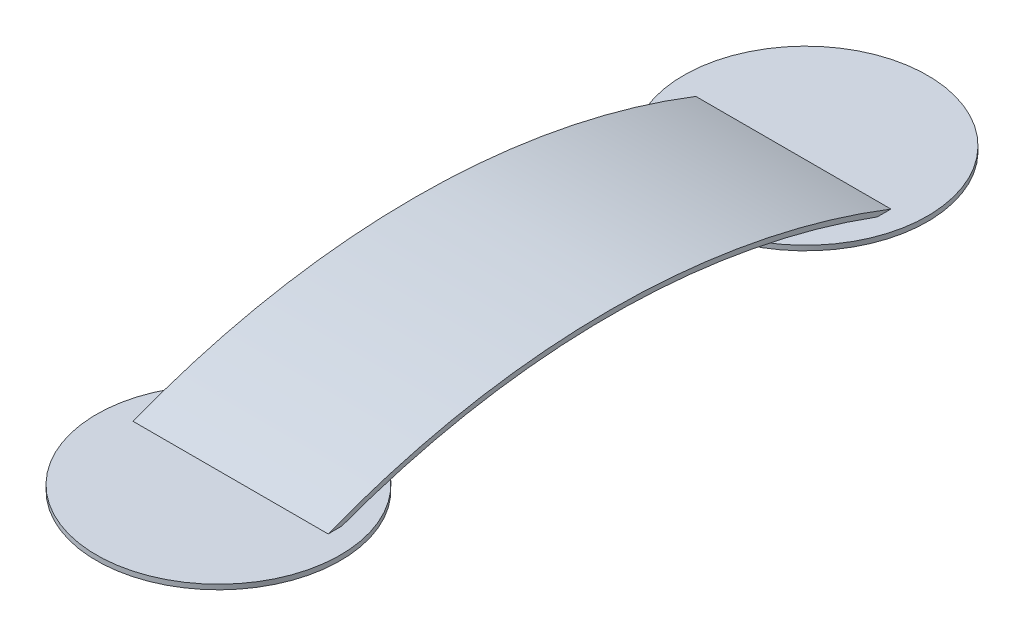
ISO-10303-21;
HEADER;
FILE_DESCRIPTION(('STEP AP214'),'2;1');
FILE_NAME('part.step','',(''),(''),'','','');
FILE_SCHEMA(('AUTOMOTIVE_DESIGN { 1 0 10303 214 1 1 1 1 }'));
ENDSEC;
DATA;
#1=APPLICATION_CONTEXT('core data for automotive mechanical design processes');
#2=APPLICATION_PROTOCOL_DEFINITION('international standard','automotive_design',2000,#1);
#3=PRODUCT_CONTEXT('',#1,'mechanical');
#4=PRODUCT('Part','Part','',(#3));
#5=PRODUCT_RELATED_PRODUCT_CATEGORY('part','',(#4));
#6=PRODUCT_DEFINITION_FORMATION('','',#4);
#7=PRODUCT_DEFINITION_CONTEXT('part definition',#1,'design');
#8=PRODUCT_DEFINITION('design','',#6,#7);
#9=PRODUCT_DEFINITION_SHAPE('','',#8);
#10=(LENGTH_UNIT() NAMED_UNIT(*) SI_UNIT(.MILLI.,.METRE.));
#11=(NAMED_UNIT(*) PLANE_ANGLE_UNIT() SI_UNIT($,.RADIAN.));
#12=(NAMED_UNIT(*) SI_UNIT($,.STERADIAN.) SOLID_ANGLE_UNIT());
#13=UNCERTAINTY_MEASURE_WITH_UNIT(LENGTH_MEASURE(1.E-05),#10,'distance_accuracy_value','');
#14=(GEOMETRIC_REPRESENTATION_CONTEXT(3) GLOBAL_UNCERTAINTY_ASSIGNED_CONTEXT((#13)) GLOBAL_UNIT_ASSIGNED_CONTEXT((#10,
#11,#12)) REPRESENTATION_CONTEXT('',''));
#15=CARTESIAN_POINT('',(0.,0.,0.));
#16=DIRECTION('',(0.,0.,1.));
#17=DIRECTION('',(1.,0.,0.));
#18=AXIS2_PLACEMENT_3D('',#15,#16,#17);
#19=CARTESIAN_POINT('',(8.,-29.3269903327954,0.));
#20=DIRECTION('',(-1.,0.,0.));
#21=DIRECTION('',(0.,0.,1.));
#22=AXIS2_PLACEMENT_3D('',#19,#20,#21);
#23=CYLINDRICAL_SURFACE('',#22,31.7011485819148);
#24=DIRECTION('',(-1.,0.,0.));
#25=VECTOR('',#24,1.);
#26=CARTESIAN_POINT('',(8.,0.199999999999999,11.537749490245));
#27=LINE('',#26,#25);
#28=CARTESIAN_POINT('',(8.,0.199999999999999,11.537749490245));
#29=VERTEX_POINT('',#28);
#30=CARTESIAN_POINT('',(0.,0.199999999999999,11.537749490245));
#31=VERTEX_POINT('',#30);
#32=EDGE_CURVE('E54',#29,#31,#27,.T.);
#33=ORIENTED_EDGE('',*,*,#32,.F.);
#34=CARTESIAN_POINT('',(8.,-29.3269903327954,0.));
#35=DIRECTION('',(1.,0.,0.));
#36=DIRECTION('',(0.,0.,1.));
#37=AXIS2_PLACEMENT_3D('',#34,#35,#36);
#38=CIRCLE('',#37,31.7011485819148);
#39=CARTESIAN_POINT('',(8.,0.199999999999999,-11.537749490245));
#40=VERTEX_POINT('',#39);
#41=EDGE_CURVE('E94',#40,#29,#38,.T.);
#42=ORIENTED_EDGE('',*,*,#41,.F.);
#43=DIRECTION('',(-1.,0.,0.));
#44=VECTOR('',#43,1.);
#45=CARTESIAN_POINT('',(8.,0.199999999999999,-11.537749490245));
#46=LINE('',#45,#44);
#47=CARTESIAN_POINT('',(0.,0.199999999999999,-11.537749490245));
#48=VERTEX_POINT('',#47);
#49=EDGE_CURVE('E111',#40,#48,#46,.T.);
#50=ORIENTED_EDGE('',*,*,#49,.T.);
#51=CARTESIAN_POINT('',(0.,-29.3269903327954,0.));
#52=DIRECTION('',(1.,0.,0.));
#53=DIRECTION('',(0.,0.,1.));
#54=AXIS2_PLACEMENT_3D('',#51,#52,#53);
#55=CIRCLE('',#54,31.7011485819148);
#56=EDGE_CURVE('E95',#48,#31,#55,.T.);
#57=ORIENTED_EDGE('',*,*,#56,.T.);
#58=EDGE_LOOP('',(#33,#42,#50,#57));
#59=FACE_BOUND('',#58,.T.);
#60=ADVANCED_FACE('F39',(#59),#23,.T.);
#61=CARTESIAN_POINT('',(8.,-29.3269903327954,0.));
#62=DIRECTION('',(-1.,0.,0.));
#63=DIRECTION('',(0.,0.,1.));
#64=AXIS2_PLACEMENT_3D('',#61,#62,#63);
#65=CYLINDRICAL_SURFACE('',#64,31.5011485819148);
#66=DIRECTION('',(-1.,0.,0.));
#67=VECTOR('',#66,1.);
#68=CARTESIAN_POINT('',(8.,0.199999999999999,10.9763019212703));
#69=LINE('',#68,#67);
#70=CARTESIAN_POINT('',(0.,0.199999999999999,10.9763019212703));
#71=VERTEX_POINT('',#70);
#72=CARTESIAN_POINT('',(8.,0.199999999999999,10.9763019212703));
#73=VERTEX_POINT('',#72);
#74=EDGE_CURVE('E79',#71,#73,#69,.F.);
#75=ORIENTED_EDGE('',*,*,#74,.F.);
#76=CARTESIAN_POINT('',(0.,-29.3269903327954,0.));
#77=DIRECTION('',(-1.,0.,0.));
#78=DIRECTION('',(0.,0.,1.));
#79=AXIS2_PLACEMENT_3D('',#76,#77,#78);
#80=CIRCLE('',#79,31.5011485819148);
#81=CARTESIAN_POINT('',(0.,0.199999999999999,-10.9763019212703));
#82=VERTEX_POINT('',#81);
#83=EDGE_CURVE('E85',#71,#82,#80,.T.);
#84=ORIENTED_EDGE('',*,*,#83,.T.);
#85=DIRECTION('',(-1.,0.,0.));
#86=VECTOR('',#85,1.);
#87=CARTESIAN_POINT('',(8.,0.199999999999999,-10.9763019212703));
#88=LINE('',#87,#86);
#89=CARTESIAN_POINT('',(8.,0.199999999999999,-10.9763019212703));
#90=VERTEX_POINT('',#89);
#91=EDGE_CURVE('E115',#82,#90,#88,.F.);
#92=ORIENTED_EDGE('',*,*,#91,.T.);
#93=CARTESIAN_POINT('',(8.,-29.3269903327954,0.));
#94=DIRECTION('',(-1.,0.,0.));
#95=DIRECTION('',(0.,0.,1.));
#96=AXIS2_PLACEMENT_3D('',#93,#94,#95);
#97=CIRCLE('',#96,31.5011485819148);
#98=EDGE_CURVE('E61',#73,#90,#97,.T.);
#99=ORIENTED_EDGE('',*,*,#98,.F.);
#100=EDGE_LOOP('',(#75,#84,#92,#99));
#101=FACE_BOUND('',#100,.T.);
#102=ADVANCED_FACE('F84',(#101),#65,.F.);
#103=CARTESIAN_POINT('',(8.,-29.3269903327954,0.));
#104=DIRECTION('',(-1.,0.,0.));
#105=DIRECTION('',(0.,0.,1.));
#106=AXIS2_PLACEMENT_3D('',#103,#104,#105);
#107=PLANE('',#106);
#108=DIRECTION('',(0.,0.,1.));
#109=VECTOR('',#108,1.);
#110=CARTESIAN_POINT('',(8.,0.199999999999999,0.));
#111=LINE('',#110,#109);
#112=EDGE_CURVE('E123',#73,#29,#111,.T.);
#113=ORIENTED_EDGE('',*,*,#112,.F.);
#114=ORIENTED_EDGE('',*,*,#98,.T.);
#115=DIRECTION('',(0.,0.,-1.));
#116=VECTOR('',#115,1.);
#117=CARTESIAN_POINT('',(8.,0.199999999999999,0.));
#118=LINE('',#117,#116);
#119=EDGE_CURVE('E101',#90,#40,#118,.T.);
#120=ORIENTED_EDGE('',*,*,#119,.T.);
#121=ORIENTED_EDGE('',*,*,#41,.T.);
#122=EDGE_LOOP('',(#113,#114,#120,#121));
#123=FACE_BOUND('',#122,.T.);
#124=ADVANCED_FACE('F156',(#123),#107,.F.);
#125=CARTESIAN_POINT('',(0.,-29.3269903327954,0.));
#126=DIRECTION('',(-1.,0.,0.));
#127=DIRECTION('',(0.,0.,1.));
#128=AXIS2_PLACEMENT_3D('',#125,#126,#127);
#129=PLANE('',#128);
#130=ORIENTED_EDGE('',*,*,#83,.F.);
#131=DIRECTION('',(0.,0.,1.));
#132=VECTOR('',#131,1.);
#133=CARTESIAN_POINT('',(0.,0.199999999999999,0.));
#134=LINE('',#133,#132);
#135=EDGE_CURVE('E11',#71,#31,#134,.T.);
#136=ORIENTED_EDGE('',*,*,#135,.T.);
#137=ORIENTED_EDGE('',*,*,#56,.F.);
#138=DIRECTION('',(0.,0.,-1.));
#139=VECTOR('',#138,1.);
#140=CARTESIAN_POINT('',(0.,0.199999999999999,0.));
#141=LINE('',#140,#139);
#142=EDGE_CURVE('E47',#82,#48,#141,.T.);
#143=ORIENTED_EDGE('',*,*,#142,.F.);
#144=EDGE_LOOP('',(#130,#136,#137,#143));
#145=FACE_BOUND('',#144,.T.);
#146=ADVANCED_FACE('F90',(#145),#129,.T.);
#147=CARTESIAN_POINT('',(4.,0.2,-12.0370452949537));
#148=DIRECTION('',(0.,1.,0.));
#149=DIRECTION('',(0.,0.,1.));
#150=AXIS2_PLACEMENT_3D('',#147,#148,#149);
#151=PLANE('',#150);
#152=CARTESIAN_POINT('',(4.,0.2,-12.0370452949537));
#153=DIRECTION('',(0.,1.,0.));
#154=DIRECTION('',(0.,0.,1.));
#155=AXIS2_PLACEMENT_3D('',#152,#153,#154);
#156=CIRCLE('',#155,5.);
#157=CARTESIAN_POINT('',(4.,0.2,-7.03704529495367));
#158=VERTEX_POINT('',#157);
#159=EDGE_CURVE('E118',#158,#158,#156,.T.);
#160=ORIENTED_EDGE('',*,*,#159,.T.);
#161=EDGE_LOOP('',(#160));
#162=FACE_BOUND('',#161,.T.);
#163=ORIENTED_EDGE('',*,*,#119,.F.);
#164=ORIENTED_EDGE('',*,*,#91,.F.);
#165=ORIENTED_EDGE('',*,*,#142,.T.);
#166=ORIENTED_EDGE('',*,*,#49,.F.);
#167=EDGE_LOOP('',(#163,#164,#165,#166));
#168=FACE_BOUND('',#167,.T.);
#169=ADVANCED_FACE('F159',(#162,#168),#151,.T.);
#170=CARTESIAN_POINT('',(4.,0.2,-12.0370452949537));
#171=DIRECTION('',(0.,-1.,0.));
#172=DIRECTION('',(0.,0.,-1.));
#173=AXIS2_PLACEMENT_3D('',#170,#171,#172);
#174=CYLINDRICAL_SURFACE('',#173,5.);
#175=ORIENTED_EDGE('',*,*,#159,.F.);
#176=EDGE_LOOP('',(#175));
#177=FACE_BOUND('',#176,.T.);
#178=CARTESIAN_POINT('',(4.,0.,-12.0370452949537));
#179=DIRECTION('',(0.,1.,0.));
#180=DIRECTION('',(0.,0.,1.));
#181=AXIS2_PLACEMENT_3D('',#178,#179,#180);
#182=CIRCLE('',#181,5.);
#183=CARTESIAN_POINT('',(4.,0.,-7.03704529495367));
#184=VERTEX_POINT('',#183);
#185=EDGE_CURVE('E119',#184,#184,#182,.T.);
#186=ORIENTED_EDGE('',*,*,#185,.T.);
#187=EDGE_LOOP('',(#186));
#188=FACE_BOUND('',#187,.T.);
#189=ADVANCED_FACE('F161',(#177,#188),#174,.T.);
#190=CARTESIAN_POINT('',(8.,0.,-11.5));
#191=DIRECTION('',(0.,1.,0.));
#192=DIRECTION('',(0.,0.,1.));
#193=AXIS2_PLACEMENT_3D('',#190,#191,#192);
#194=PLANE('',#193);
#195=ORIENTED_EDGE('',*,*,#185,.F.);
#196=EDGE_LOOP('',(#195));
#197=FACE_BOUND('',#196,.T.);
#198=ADVANCED_FACE('F168',(#197),#194,.F.);
#199=CARTESIAN_POINT('',(4.,0.2,12.0370452949537));
#200=DIRECTION('',(0.,-1.,0.));
#201=DIRECTION('',(0.,0.,-1.));
#202=AXIS2_PLACEMENT_3D('',#199,#200,#201);
#203=PLANE('',#202);
#204=CARTESIAN_POINT('',(4.,0.2,12.0370452949537));
#205=DIRECTION('',(0.,1.,0.));
#206=DIRECTION('',(0.,0.,-1.));
#207=AXIS2_PLACEMENT_3D('',#204,#205,#206);
#208=CIRCLE('',#207,5.);
#209=CARTESIAN_POINT('',(4.,0.2,7.03704529495367));
#210=VERTEX_POINT('',#209);
#211=EDGE_CURVE('E88',#210,#210,#208,.T.);
#212=ORIENTED_EDGE('',*,*,#211,.T.);
#213=EDGE_LOOP('',(#212));
#214=FACE_BOUND('',#213,.T.);
#215=ORIENTED_EDGE('',*,*,#74,.T.);
#216=ORIENTED_EDGE('',*,*,#112,.T.);
#217=ORIENTED_EDGE('',*,*,#32,.T.);
#218=ORIENTED_EDGE('',*,*,#135,.F.);
#219=EDGE_LOOP('',(#215,#216,#217,#218));
#220=FACE_BOUND('',#219,.T.);
#221=ADVANCED_FACE('F78',(#214,#220),#203,.F.);
#222=CARTESIAN_POINT('',(4.,0.2,12.0370452949537));
#223=DIRECTION('',(0.,-1.,0.));
#224=DIRECTION('',(0.,0.,-1.));
#225=AXIS2_PLACEMENT_3D('',#222,#223,#224);
#226=CYLINDRICAL_SURFACE('',#225,5.);
#227=ORIENTED_EDGE('',*,*,#211,.F.);
#228=EDGE_LOOP('',(#227));
#229=FACE_BOUND('',#228,.T.);
#230=CARTESIAN_POINT('',(4.,0.,12.0370452949537));
#231=DIRECTION('',(0.,1.,0.));
#232=DIRECTION('',(0.,0.,-1.));
#233=AXIS2_PLACEMENT_3D('',#230,#231,#232);
#234=CIRCLE('',#233,5.);
#235=CARTESIAN_POINT('',(4.,0.,7.03704529495367));
#236=VERTEX_POINT('',#235);
#237=EDGE_CURVE('E131',#236,#236,#234,.T.);
#238=ORIENTED_EDGE('',*,*,#237,.T.);
#239=EDGE_LOOP('',(#238));
#240=FACE_BOUND('',#239,.T.);
#241=ADVANCED_FACE('F140',(#229,#240),#226,.T.);
#242=CARTESIAN_POINT('',(8.,0.,11.5));
#243=DIRECTION('',(0.,1.,0.));
#244=DIRECTION('',(0.,0.,1.));
#245=AXIS2_PLACEMENT_3D('',#242,#243,#244);
#246=PLANE('',#245);
#247=ORIENTED_EDGE('',*,*,#237,.F.);
#248=EDGE_LOOP('',(#247));
#249=FACE_BOUND('',#248,.T.);
#250=ADVANCED_FACE('F143',(#249),#246,.F.);
#251=CLOSED_SHELL('',(#60,#102,#124,#146,#169,#189,#198,#221,#241,#250));
#252=MANIFOLD_SOLID_BREP('B2',#251);
#253=ADVANCED_BREP_SHAPE_REPRESENTATION('',(#18,#252),#14);
#254=SHAPE_DEFINITION_REPRESENTATION(#9,#253);
ENDSEC;
END-ISO-10303-21;
